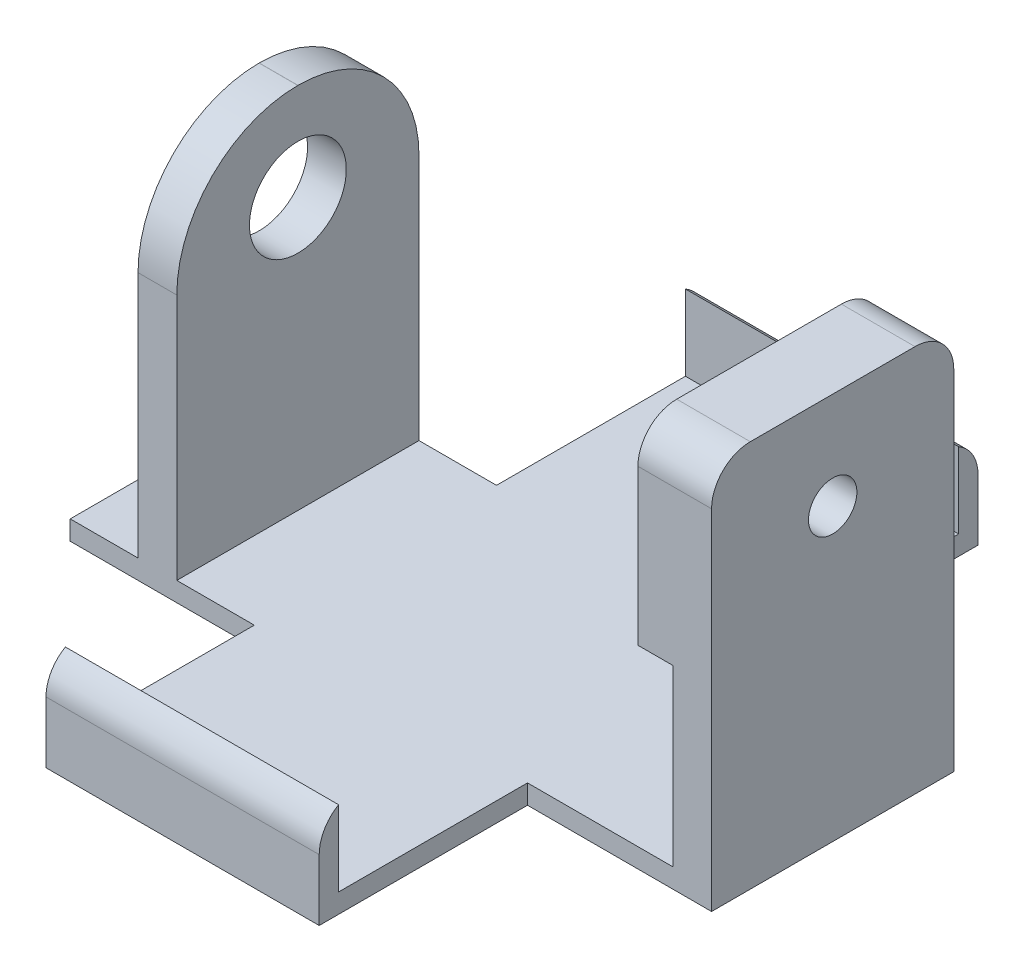
ISO-10303-21;
HEADER;
FILE_DESCRIPTION(('STEP AP214'),'2;1');
FILE_NAME('part.step','',(''),(''),'','','');
FILE_SCHEMA(('AUTOMOTIVE_DESIGN { 1 0 10303 214 1 1 1 1 }'));
ENDSEC;
DATA;
#1=APPLICATION_CONTEXT('core data for automotive mechanical design processes');
#2=APPLICATION_PROTOCOL_DEFINITION('international standard','automotive_design',2000,#1);
#3=PRODUCT_CONTEXT('',#1,'mechanical');
#4=PRODUCT('Part','Part','',(#3));
#5=PRODUCT_RELATED_PRODUCT_CATEGORY('part','',(#4));
#6=PRODUCT_DEFINITION_FORMATION('','',#4);
#7=PRODUCT_DEFINITION_CONTEXT('part definition',#1,'design');
#8=PRODUCT_DEFINITION('design','',#6,#7);
#9=PRODUCT_DEFINITION_SHAPE('','',#8);
#10=(LENGTH_UNIT() NAMED_UNIT(*) SI_UNIT(.MILLI.,.METRE.));
#11=(NAMED_UNIT(*) PLANE_ANGLE_UNIT() SI_UNIT($,.RADIAN.));
#12=(NAMED_UNIT(*) SI_UNIT($,.STERADIAN.) SOLID_ANGLE_UNIT());
#13=UNCERTAINTY_MEASURE_WITH_UNIT(LENGTH_MEASURE(1.E-05),#10,'distance_accuracy_value','');
#14=(GEOMETRIC_REPRESENTATION_CONTEXT(3) GLOBAL_UNCERTAINTY_ASSIGNED_CONTEXT((#13)) GLOBAL_UNIT_ASSIGNED_CONTEXT((#10,
#11,#12)) REPRESENTATION_CONTEXT('',''));
#15=CARTESIAN_POINT('',(0.,0.,0.));
#16=DIRECTION('',(0.,0.,1.));
#17=DIRECTION('',(1.,0.,0.));
#18=AXIS2_PLACEMENT_3D('',#15,#16,#17);
#19=CARTESIAN_POINT('',(0.,2.,0.));
#20=DIRECTION('',(0.,-1.,0.));
#21=DIRECTION('',(0.,0.,-1.));
#22=AXIS2_PLACEMENT_3D('',#19,#20,#21);
#23=PLANE('',#22);
#24=DIRECTION('',(0.,0.,-1.));
#25=VECTOR('',#24,1.);
#26=CARTESIAN_POINT('',(-22.1,2.,0.));
#27=LINE('',#26,#25);
#28=CARTESIAN_POINT('',(-22.1,2.,12.5));
#29=VERTEX_POINT('',#28);
#30=CARTESIAN_POINT('',(-22.1,2.,-12.5));
#31=VERTEX_POINT('',#30);
#32=EDGE_CURVE('E293',#29,#31,#27,.T.);
#33=ORIENTED_EDGE('',*,*,#32,.F.);
#34=DIRECTION('',(1.,0.,0.));
#35=VECTOR('',#34,1.);
#36=CARTESIAN_POINT('',(-33.1,2.,12.5));
#37=LINE('',#36,#35);
#38=CARTESIAN_POINT('',(-14.1,2.,12.5));
#39=VERTEX_POINT('',#38);
#40=EDGE_CURVE('E233',#29,#39,#37,.T.);
#41=ORIENTED_EDGE('',*,*,#40,.T.);
#42=DIRECTION('',(0.,0.,1.));
#43=VECTOR('',#42,1.);
#44=CARTESIAN_POINT('',(-14.1,2.,34.));
#45=LINE('',#44,#43);
#46=CARTESIAN_POINT('',(-14.1,2.,32.));
#47=VERTEX_POINT('',#46);
#48=EDGE_CURVE('E395',#39,#47,#45,.T.);
#49=ORIENTED_EDGE('',*,*,#48,.T.);
#50=DIRECTION('',(-1.,0.,0.));
#51=VECTOR('',#50,1.);
#52=CARTESIAN_POINT('',(0.,2.,32.));
#53=LINE('',#52,#51);
#54=CARTESIAN_POINT('',(14.1,2.,32.));
#55=VERTEX_POINT('',#54);
#56=EDGE_CURVE('E371',#55,#47,#53,.T.);
#57=ORIENTED_EDGE('',*,*,#56,.F.);
#58=DIRECTION('',(0.,0.,-1.));
#59=VECTOR('',#58,1.);
#60=CARTESIAN_POINT('',(14.1,2.,34.));
#61=LINE('',#60,#59);
#62=CARTESIAN_POINT('',(14.1,2.,12.5));
#63=VERTEX_POINT('',#62);
#64=EDGE_CURVE('E398',#55,#63,#61,.T.);
#65=ORIENTED_EDGE('',*,*,#64,.T.);
#66=DIRECTION('',(1.,0.,0.));
#67=VECTOR('',#66,1.);
#68=CARTESIAN_POINT('',(14.1,2.,12.5));
#69=LINE('',#68,#67);
#70=CARTESIAN_POINT('',(29.1,2.,12.5));
#71=VERTEX_POINT('',#70);
#72=EDGE_CURVE('E401',#63,#71,#69,.T.);
#73=ORIENTED_EDGE('',*,*,#72,.T.);
#74=DIRECTION('',(0.,0.,1.));
#75=VECTOR('',#74,1.);
#76=CARTESIAN_POINT('',(29.1,2.,-34.001));
#77=LINE('',#76,#75);
#78=CARTESIAN_POINT('',(29.1,2.,-12.5));
#79=VERTEX_POINT('',#78);
#80=EDGE_CURVE('E311',#79,#71,#77,.T.);
#81=ORIENTED_EDGE('',*,*,#80,.F.);
#82=DIRECTION('',(-1.,0.,0.));
#83=VECTOR('',#82,1.);
#84=CARTESIAN_POINT('',(14.1,2.,-12.5));
#85=LINE('',#84,#83);
#86=CARTESIAN_POINT('',(14.1,2.,-12.5));
#87=VERTEX_POINT('',#86);
#88=EDGE_CURVE('E404',#79,#87,#85,.T.);
#89=ORIENTED_EDGE('',*,*,#88,.T.);
#90=DIRECTION('',(0.,0.,-1.));
#91=VECTOR('',#90,1.);
#92=CARTESIAN_POINT('',(14.1,2.,-12.5));
#93=LINE('',#92,#91);
#94=CARTESIAN_POINT('',(14.1,2.,-32.));
#95=VERTEX_POINT('',#94);
#96=EDGE_CURVE('E376',#87,#95,#93,.T.);
#97=ORIENTED_EDGE('',*,*,#96,.T.);
#98=DIRECTION('',(1.,0.,0.));
#99=VECTOR('',#98,1.);
#100=CARTESIAN_POINT('',(0.,2.,-32.));
#101=LINE('',#100,#99);
#102=CARTESIAN_POINT('',(-14.1,2.,-32.));
#103=VERTEX_POINT('',#102);
#104=EDGE_CURVE('E356',#103,#95,#101,.T.);
#105=ORIENTED_EDGE('',*,*,#104,.F.);
#106=DIRECTION('',(0.,0.,1.));
#107=VECTOR('',#106,1.);
#108=CARTESIAN_POINT('',(-14.1,2.,-12.5));
#109=LINE('',#108,#107);
#110=CARTESIAN_POINT('',(-14.1,2.,-12.5));
#111=VERTEX_POINT('',#110);
#112=EDGE_CURVE('E379',#103,#111,#109,.T.);
#113=ORIENTED_EDGE('',*,*,#112,.T.);
#114=DIRECTION('',(-1.,0.,0.));
#115=VECTOR('',#114,1.);
#116=CARTESIAN_POINT('',(-33.1,2.,-12.5));
#117=LINE('',#116,#115);
#118=EDGE_CURVE('E384',#111,#31,#117,.T.);
#119=ORIENTED_EDGE('',*,*,#118,.T.);
#120=EDGE_LOOP('',(#33,#41,#49,#57,#65,#73,#81,#89,#97,#105,#113,#119));
#121=FACE_BOUND('',#120,.T.);
#122=ADVANCED_FACE('F39',(#121),#23,.F.);
#123=CARTESIAN_POINT('',(-33.1,2.,12.5));
#124=VERTEX_POINT('',#123);
#125=CARTESIAN_POINT('',(-26.1,2.,12.5));
#126=VERTEX_POINT('',#125);
#127=EDGE_CURVE('E391',#124,#126,#37,.T.);
#128=ORIENTED_EDGE('',*,*,#127,.T.);
#129=DIRECTION('',(0.,0.,-1.));
#130=VECTOR('',#129,1.);
#131=CARTESIAN_POINT('',(-26.1,2.,0.));
#132=LINE('',#131,#130);
#133=CARTESIAN_POINT('',(-26.1,2.,-12.5));
#134=VERTEX_POINT('',#133);
#135=EDGE_CURVE('E285',#126,#134,#132,.T.);
#136=ORIENTED_EDGE('',*,*,#135,.T.);
#137=CARTESIAN_POINT('',(-33.1,2.,-12.5));
#138=VERTEX_POINT('',#137);
#139=EDGE_CURVE('E383',#134,#138,#117,.T.);
#140=ORIENTED_EDGE('',*,*,#139,.T.);
#141=DIRECTION('',(0.,0.,1.));
#142=VECTOR('',#141,1.);
#143=CARTESIAN_POINT('',(-33.1,2.,-12.5));
#144=LINE('',#143,#142);
#145=EDGE_CURVE('E388',#138,#124,#144,.T.);
#146=ORIENTED_EDGE('',*,*,#145,.T.);
#147=EDGE_LOOP('',(#128,#136,#140,#146));
#148=FACE_BOUND('',#147,.T.);
#149=ADVANCED_FACE('F587',(#148),#23,.F.);
#150=CARTESIAN_POINT('',(14.1,2.,-12.5));
#151=DIRECTION('',(-1.,0.,0.));
#152=DIRECTION('',(0.,0.,1.));
#153=AXIS2_PLACEMENT_3D('',#150,#151,#152);
#154=PLANE('',#153);
#155=DIRECTION('',(0.,-1.,0.));
#156=VECTOR('',#155,1.);
#157=CARTESIAN_POINT('',(14.1,2.,-34.));
#158=LINE('',#157,#156);
#159=CARTESIAN_POINT('',(14.1,6.33589838486222,-34.));
#160=VERTEX_POINT('',#159);
#161=CARTESIAN_POINT('',(14.1,0.,-34.));
#162=VERTEX_POINT('',#161);
#163=EDGE_CURVE('E486',#160,#162,#158,.T.);
#164=ORIENTED_EDGE('',*,*,#163,.F.);
#165=CARTESIAN_POINT('',(14.1,6.33589838486222,-30.));
#166=DIRECTION('',(-1.,0.,0.));
#167=DIRECTION('',(0.,0.,1.));
#168=AXIS2_PLACEMENT_3D('',#165,#166,#167);
#169=CIRCLE('',#168,4.);
#170=CARTESIAN_POINT('',(14.1,9.8,-32.));
#171=VERTEX_POINT('',#170);
#172=EDGE_CURVE('E505',#160,#171,#169,.F.);
#173=ORIENTED_EDGE('',*,*,#172,.T.);
#174=DIRECTION('',(0.,1.,0.));
#175=VECTOR('',#174,1.);
#176=CARTESIAN_POINT('',(14.1,9.8,-32.));
#177=LINE('',#176,#175);
#178=EDGE_CURVE('E352',#95,#171,#177,.T.);
#179=ORIENTED_EDGE('',*,*,#178,.F.);
#180=ORIENTED_EDGE('',*,*,#96,.F.);
#181=DIRECTION('',(0.,-1.,0.));
#182=VECTOR('',#181,1.);
#183=CARTESIAN_POINT('',(14.1,2.,-12.5));
#184=LINE('',#183,#182);
#185=CARTESIAN_POINT('',(14.1,0.,-12.5));
#186=VERTEX_POINT('',#185);
#187=EDGE_CURVE('E407',#87,#186,#184,.T.);
#188=ORIENTED_EDGE('',*,*,#187,.T.);
#189=DIRECTION('',(0.,0.,-1.));
#190=VECTOR('',#189,1.);
#191=CARTESIAN_POINT('',(14.1,0.,-12.5));
#192=LINE('',#191,#190);
#193=EDGE_CURVE('E375',#186,#162,#192,.T.);
#194=ORIENTED_EDGE('',*,*,#193,.T.);
#195=EDGE_LOOP('',(#164,#173,#179,#180,#188,#194));
#196=FACE_BOUND('',#195,.T.);
#197=ADVANCED_FACE('F559',(#196),#154,.F.);
#198=CARTESIAN_POINT('',(-14.1,2.,-34.));
#199=DIRECTION('',(0.,0.,1.));
#200=DIRECTION('',(1.,0.,0.));
#201=AXIS2_PLACEMENT_3D('',#198,#199,#200);
#202=PLANE('',#201);
#203=DIRECTION('',(0.,-1.,0.));
#204=VECTOR('',#203,1.);
#205=CARTESIAN_POINT('',(-14.1,2.,-34.));
#206=LINE('',#205,#204);
#207=CARTESIAN_POINT('',(-14.1,6.33589838486222,-34.));
#208=VERTEX_POINT('',#207);
#209=CARTESIAN_POINT('',(-14.1,0.,-34.));
#210=VERTEX_POINT('',#209);
#211=EDGE_CURVE('E483',#208,#210,#206,.T.);
#212=ORIENTED_EDGE('',*,*,#211,.F.);
#213=DIRECTION('',(1.,0.,0.));
#214=VECTOR('',#213,1.);
#215=CARTESIAN_POINT('',(-14.1,6.33589838486222,-34.));
#216=LINE('',#215,#214);
#217=EDGE_CURVE('E502',#208,#160,#216,.T.);
#218=ORIENTED_EDGE('',*,*,#217,.T.);
#219=ORIENTED_EDGE('',*,*,#163,.T.);
#220=DIRECTION('',(-1.,0.,0.));
#221=VECTOR('',#220,1.);
#222=CARTESIAN_POINT('',(-14.1,0.,-34.));
#223=LINE('',#222,#221);
#224=EDGE_CURVE('E411',#162,#210,#223,.T.);
#225=ORIENTED_EDGE('',*,*,#224,.T.);
#226=EDGE_LOOP('',(#212,#218,#219,#225));
#227=FACE_BOUND('',#226,.T.);
#228=ADVANCED_FACE('F669',(#227),#202,.F.);
#229=CARTESIAN_POINT('',(-14.1,2.,-12.5));
#230=DIRECTION('',(1.,0.,0.));
#231=DIRECTION('',(0.,0.,-1.));
#232=AXIS2_PLACEMENT_3D('',#229,#230,#231);
#233=PLANE('',#232);
#234=DIRECTION('',(0.,-1.,0.));
#235=VECTOR('',#234,1.);
#236=CARTESIAN_POINT('',(-14.1,9.8,-32.));
#237=LINE('',#236,#235);
#238=CARTESIAN_POINT('',(-14.1,9.8,-32.));
#239=VERTEX_POINT('',#238);
#240=EDGE_CURVE('E341',#239,#103,#237,.T.);
#241=ORIENTED_EDGE('',*,*,#240,.F.);
#242=CARTESIAN_POINT('',(-14.1,6.33589838486222,-30.));
#243=DIRECTION('',(1.,0.,0.));
#244=DIRECTION('',(0.,0.,-1.));
#245=AXIS2_PLACEMENT_3D('',#242,#243,#244);
#246=CIRCLE('',#245,4.);
#247=EDGE_CURVE('E499',#239,#208,#246,.F.);
#248=ORIENTED_EDGE('',*,*,#247,.T.);
#249=ORIENTED_EDGE('',*,*,#211,.T.);
#250=DIRECTION('',(0.,0.,1.));
#251=VECTOR('',#250,1.);
#252=CARTESIAN_POINT('',(-14.1,0.,-12.5));
#253=LINE('',#252,#251);
#254=CARTESIAN_POINT('',(-14.1,0.,-12.5));
#255=VERTEX_POINT('',#254);
#256=EDGE_CURVE('E415',#210,#255,#253,.T.);
#257=ORIENTED_EDGE('',*,*,#256,.T.);
#258=DIRECTION('',(0.,-1.,0.));
#259=VECTOR('',#258,1.);
#260=CARTESIAN_POINT('',(-14.1,2.,-12.5));
#261=LINE('',#260,#259);
#262=EDGE_CURVE('E479',#111,#255,#261,.T.);
#263=ORIENTED_EDGE('',*,*,#262,.F.);
#264=ORIENTED_EDGE('',*,*,#112,.F.);
#265=EDGE_LOOP('',(#241,#248,#249,#257,#263,#264));
#266=FACE_BOUND('',#265,.T.);
#267=ADVANCED_FACE('F569',(#266),#233,.F.);
#268=CARTESIAN_POINT('',(-33.1,2.,-12.5));
#269=DIRECTION('',(0.,0.,1.));
#270=DIRECTION('',(1.,0.,0.));
#271=AXIS2_PLACEMENT_3D('',#268,#269,#270);
#272=PLANE('',#271);
#273=ORIENTED_EDGE('',*,*,#139,.F.);
#274=DIRECTION('',(0.,-1.,0.));
#275=VECTOR('',#274,1.);
#276=CARTESIAN_POINT('',(-26.1,0.,-12.5));
#277=LINE('',#276,#275);
#278=CARTESIAN_POINT('',(-26.1,27.5099999999999,-12.5));
#279=VERTEX_POINT('',#278);
#280=EDGE_CURVE('E55',#279,#134,#277,.T.);
#281=ORIENTED_EDGE('',*,*,#280,.F.);
#282=DIRECTION('',(-1.,0.,0.));
#283=VECTOR('',#282,1.);
#284=CARTESIAN_POINT('',(-22.1,27.5099999999999,-12.5));
#285=LINE('',#284,#283);
#286=CARTESIAN_POINT('',(-22.1,27.5099999999999,-12.5));
#287=VERTEX_POINT('',#286);
#288=EDGE_CURVE('E282',#287,#279,#285,.T.);
#289=ORIENTED_EDGE('',*,*,#288,.F.);
#290=DIRECTION('',(0.,-1.,0.));
#291=VECTOR('',#290,1.);
#292=CARTESIAN_POINT('',(-22.1,0.,-12.5));
#293=LINE('',#292,#291);
#294=EDGE_CURVE('E247',#287,#31,#293,.T.);
#295=ORIENTED_EDGE('',*,*,#294,.T.);
#296=ORIENTED_EDGE('',*,*,#118,.F.);
#297=ORIENTED_EDGE('',*,*,#262,.T.);
#298=DIRECTION('',(-1.,0.,0.));
#299=VECTOR('',#298,1.);
#300=CARTESIAN_POINT('',(-33.1,0.,-12.5));
#301=LINE('',#300,#299);
#302=CARTESIAN_POINT('',(-33.1,0.,-12.5));
#303=VERTEX_POINT('',#302);
#304=EDGE_CURVE('E418',#255,#303,#301,.T.);
#305=ORIENTED_EDGE('',*,*,#304,.T.);
#306=DIRECTION('',(0.,-1.,0.));
#307=VECTOR('',#306,1.);
#308=CARTESIAN_POINT('',(-33.1,2.,-12.5));
#309=LINE('',#308,#307);
#310=EDGE_CURVE('E475',#138,#303,#309,.T.);
#311=ORIENTED_EDGE('',*,*,#310,.F.);
#312=EDGE_LOOP('',(#273,#281,#289,#295,#296,#297,#305,#311));
#313=FACE_BOUND('',#312,.T.);
#314=ADVANCED_FACE('F575',(#313),#272,.F.);
#315=CARTESIAN_POINT('',(-33.1,2.,-12.5));
#316=DIRECTION('',(1.,0.,0.));
#317=DIRECTION('',(0.,0.,-1.));
#318=AXIS2_PLACEMENT_3D('',#315,#316,#317);
#319=PLANE('',#318);
#320=DIRECTION('',(0.,0.,1.));
#321=VECTOR('',#320,1.);
#322=CARTESIAN_POINT('',(-33.1,0.,-12.5));
#323=LINE('',#322,#321);
#324=CARTESIAN_POINT('',(-33.1,0.,12.5));
#325=VERTEX_POINT('',#324);
#326=EDGE_CURVE('E421',#303,#325,#323,.T.);
#327=ORIENTED_EDGE('',*,*,#326,.T.);
#328=DIRECTION('',(0.,-1.,0.));
#329=VECTOR('',#328,1.);
#330=CARTESIAN_POINT('',(-33.1,2.,12.5));
#331=LINE('',#330,#329);
#332=EDGE_CURVE('E471',#124,#325,#331,.T.);
#333=ORIENTED_EDGE('',*,*,#332,.F.);
#334=ORIENTED_EDGE('',*,*,#145,.F.);
#335=ORIENTED_EDGE('',*,*,#310,.T.);
#336=EDGE_LOOP('',(#327,#333,#334,#335));
#337=FACE_BOUND('',#336,.T.);
#338=ADVANCED_FACE('F592',(#337),#319,.F.);
#339=CARTESIAN_POINT('',(-33.1,2.,12.5));
#340=DIRECTION('',(0.,0.,-1.));
#341=DIRECTION('',(-1.,0.,0.));
#342=AXIS2_PLACEMENT_3D('',#339,#340,#341);
#343=PLANE('',#342);
#344=DIRECTION('',(1.,0.,0.));
#345=VECTOR('',#344,1.);
#346=CARTESIAN_POINT('',(-33.1,0.,12.5));
#347=LINE('',#346,#345);
#348=CARTESIAN_POINT('',(-14.1,0.,12.5));
#349=VERTEX_POINT('',#348);
#350=EDGE_CURVE('E424',#325,#349,#347,.T.);
#351=ORIENTED_EDGE('',*,*,#350,.T.);
#352=DIRECTION('',(0.,-1.,0.));
#353=VECTOR('',#352,1.);
#354=CARTESIAN_POINT('',(-14.1,2.,12.5));
#355=LINE('',#354,#353);
#356=EDGE_CURVE('E467',#39,#349,#355,.T.);
#357=ORIENTED_EDGE('',*,*,#356,.F.);
#358=ORIENTED_EDGE('',*,*,#40,.F.);
#359=DIRECTION('',(0.,1.,0.));
#360=VECTOR('',#359,1.);
#361=CARTESIAN_POINT('',(-22.1,0.,12.5));
#362=LINE('',#361,#360);
#363=CARTESIAN_POINT('',(-22.1,27.5099999999999,12.5));
#364=VERTEX_POINT('',#363);
#365=EDGE_CURVE('E226',#29,#364,#362,.T.);
#366=ORIENTED_EDGE('',*,*,#365,.T.);
#367=DIRECTION('',(-1.,0.,0.));
#368=VECTOR('',#367,1.);
#369=CARTESIAN_POINT('',(-22.1,27.5099999999999,12.5));
#370=LINE('',#369,#368);
#371=CARTESIAN_POINT('',(-26.1,27.5099999999999,12.5));
#372=VERTEX_POINT('',#371);
#373=EDGE_CURVE('E230',#364,#372,#370,.T.);
#374=ORIENTED_EDGE('',*,*,#373,.T.);
#375=DIRECTION('',(0.,1.,0.));
#376=VECTOR('',#375,1.);
#377=CARTESIAN_POINT('',(-26.1,0.,12.5));
#378=LINE('',#377,#376);
#379=EDGE_CURVE('E267',#126,#372,#378,.T.);
#380=ORIENTED_EDGE('',*,*,#379,.F.);
#381=ORIENTED_EDGE('',*,*,#127,.F.);
#382=ORIENTED_EDGE('',*,*,#332,.T.);
#383=EDGE_LOOP('',(#351,#357,#358,#366,#374,#380,#381,#382));
#384=FACE_BOUND('',#383,.T.);
#385=ADVANCED_FACE('F228',(#384),#343,.F.);
#386=CARTESIAN_POINT('',(-14.1,2.,34.));
#387=DIRECTION('',(1.,0.,0.));
#388=DIRECTION('',(0.,0.,-1.));
#389=AXIS2_PLACEMENT_3D('',#386,#387,#388);
#390=PLANE('',#389);
#391=DIRECTION('',(0.,0.,1.));
#392=VECTOR('',#391,1.);
#393=CARTESIAN_POINT('',(-14.1,0.,34.));
#394=LINE('',#393,#392);
#395=CARTESIAN_POINT('',(-14.1,0.,34.));
#396=VERTEX_POINT('',#395);
#397=EDGE_CURVE('E427',#349,#396,#394,.T.);
#398=ORIENTED_EDGE('',*,*,#397,.T.);
#399=DIRECTION('',(0.,-1.,0.));
#400=VECTOR('',#399,1.);
#401=CARTESIAN_POINT('',(-14.1,2.,34.));
#402=LINE('',#401,#400);
#403=CARTESIAN_POINT('',(-14.1,6.33589838486225,34.));
#404=VERTEX_POINT('',#403);
#405=EDGE_CURVE('E464',#404,#396,#402,.T.);
#406=ORIENTED_EDGE('',*,*,#405,.F.);
#407=CARTESIAN_POINT('',(-14.1,6.33589838486225,30.));
#408=DIRECTION('',(1.,0.,0.));
#409=DIRECTION('',(0.,0.,-1.));
#410=AXIS2_PLACEMENT_3D('',#407,#408,#409);
#411=CIRCLE('',#410,4.);
#412=CARTESIAN_POINT('',(-14.1,9.8,32.));
#413=VERTEX_POINT('',#412);
#414=EDGE_CURVE('E493',#404,#413,#411,.F.);
#415=ORIENTED_EDGE('',*,*,#414,.T.);
#416=DIRECTION('',(0.,-1.,0.));
#417=VECTOR('',#416,1.);
#418=CARTESIAN_POINT('',(-14.1,9.8,32.));
#419=LINE('',#418,#417);
#420=EDGE_CURVE('E360',#413,#47,#419,.T.);
#421=ORIENTED_EDGE('',*,*,#420,.T.);
#422=ORIENTED_EDGE('',*,*,#48,.F.);
#423=ORIENTED_EDGE('',*,*,#356,.T.);
#424=EDGE_LOOP('',(#398,#406,#415,#421,#422,#423));
#425=FACE_BOUND('',#424,.T.);
#426=ADVANCED_FACE('F599',(#425),#390,.F.);
#427=CARTESIAN_POINT('',(-14.1,2.,34.));
#428=DIRECTION('',(0.,0.,-1.));
#429=DIRECTION('',(-1.,0.,0.));
#430=AXIS2_PLACEMENT_3D('',#427,#428,#429);
#431=PLANE('',#430);
#432=DIRECTION('',(1.,0.,0.));
#433=VECTOR('',#432,1.);
#434=CARTESIAN_POINT('',(-14.1,0.,34.));
#435=LINE('',#434,#433);
#436=CARTESIAN_POINT('',(14.1,0.,34.));
#437=VERTEX_POINT('',#436);
#438=EDGE_CURVE('E431',#396,#437,#435,.T.);
#439=ORIENTED_EDGE('',*,*,#438,.T.);
#440=DIRECTION('',(0.,-1.,0.));
#441=VECTOR('',#440,1.);
#442=CARTESIAN_POINT('',(14.1,2.,34.));
#443=LINE('',#442,#441);
#444=CARTESIAN_POINT('',(14.1,6.33589838486225,34.));
#445=VERTEX_POINT('',#444);
#446=EDGE_CURVE('E461',#445,#437,#443,.T.);
#447=ORIENTED_EDGE('',*,*,#446,.F.);
#448=DIRECTION('',(1.,0.,0.));
#449=VECTOR('',#448,1.);
#450=CARTESIAN_POINT('',(-14.1,6.33589838486225,34.));
#451=LINE('',#450,#449);
#452=EDGE_CURVE('E489',#445,#404,#451,.F.);
#453=ORIENTED_EDGE('',*,*,#452,.T.);
#454=ORIENTED_EDGE('',*,*,#405,.T.);
#455=EDGE_LOOP('',(#439,#447,#453,#454));
#456=FACE_BOUND('',#455,.T.);
#457=ADVANCED_FACE('F627',(#456),#431,.F.);
#458=CARTESIAN_POINT('',(14.1,2.,34.));
#459=DIRECTION('',(-1.,0.,0.));
#460=DIRECTION('',(0.,0.,1.));
#461=AXIS2_PLACEMENT_3D('',#458,#459,#460);
#462=PLANE('',#461);
#463=ORIENTED_EDGE('',*,*,#64,.F.);
#464=DIRECTION('',(0.,1.,0.));
#465=VECTOR('',#464,1.);
#466=CARTESIAN_POINT('',(14.1,9.8,32.));
#467=LINE('',#466,#465);
#468=CARTESIAN_POINT('',(14.1,9.8,32.));
#469=VERTEX_POINT('',#468);
#470=EDGE_CURVE('E364',#55,#469,#467,.T.);
#471=ORIENTED_EDGE('',*,*,#470,.T.);
#472=CARTESIAN_POINT('',(14.1,6.33589838486225,30.));
#473=DIRECTION('',(-1.,0.,0.));
#474=DIRECTION('',(0.,0.,1.));
#475=AXIS2_PLACEMENT_3D('',#472,#473,#474);
#476=CIRCLE('',#475,4.);
#477=EDGE_CURVE('E496',#469,#445,#476,.F.);
#478=ORIENTED_EDGE('',*,*,#477,.T.);
#479=ORIENTED_EDGE('',*,*,#446,.T.);
#480=DIRECTION('',(0.,0.,-1.));
#481=VECTOR('',#480,1.);
#482=CARTESIAN_POINT('',(14.1,0.,34.));
#483=LINE('',#482,#481);
#484=CARTESIAN_POINT('',(14.1,0.,12.5));
#485=VERTEX_POINT('',#484);
#486=EDGE_CURVE('E435',#437,#485,#483,.T.);
#487=ORIENTED_EDGE('',*,*,#486,.T.);
#488=DIRECTION('',(0.,-1.,0.));
#489=VECTOR('',#488,1.);
#490=CARTESIAN_POINT('',(14.1,2.,12.5));
#491=LINE('',#490,#489);
#492=EDGE_CURVE('E457',#63,#485,#491,.T.);
#493=ORIENTED_EDGE('',*,*,#492,.F.);
#494=EDGE_LOOP('',(#463,#471,#478,#479,#487,#493));
#495=FACE_BOUND('',#494,.T.);
#496=ADVANCED_FACE('F609',(#495),#462,.F.);
#497=CARTESIAN_POINT('',(14.1,2.,12.5));
#498=DIRECTION('',(0.,0.,-1.));
#499=DIRECTION('',(-1.,0.,0.));
#500=AXIS2_PLACEMENT_3D('',#497,#498,#499);
#501=PLANE('',#500);
#502=DIRECTION('',(0.,-1.,0.));
#503=VECTOR('',#502,1.);
#504=CARTESIAN_POINT('',(25.5,0.,12.5));
#505=LINE('',#504,#503);
#506=CARTESIAN_POINT('',(25.5,36.,12.5));
#507=VERTEX_POINT('',#506);
#508=CARTESIAN_POINT('',(25.5,20.,12.5));
#509=VERTEX_POINT('',#508);
#510=EDGE_CURVE('E338',#507,#509,#505,.T.);
#511=ORIENTED_EDGE('',*,*,#510,.T.);
#512=DIRECTION('',(-1.,0.,0.));
#513=VECTOR('',#512,1.);
#514=CARTESIAN_POINT('',(25.5,20.,12.5));
#515=LINE('',#514,#513);
#516=CARTESIAN_POINT('',(29.1,20.,12.5));
#517=VERTEX_POINT('',#516);
#518=EDGE_CURVE('E308',#517,#509,#515,.T.);
#519=ORIENTED_EDGE('',*,*,#518,.F.);
#520=DIRECTION('',(0.,1.,0.));
#521=VECTOR('',#520,1.);
#522=CARTESIAN_POINT('',(29.1,2.,12.5));
#523=LINE('',#522,#521);
#524=EDGE_CURVE('E304',#71,#517,#523,.T.);
#525=ORIENTED_EDGE('',*,*,#524,.F.);
#526=ORIENTED_EDGE('',*,*,#72,.F.);
#527=ORIENTED_EDGE('',*,*,#492,.T.);
#528=DIRECTION('',(1.,0.,0.));
#529=VECTOR('',#528,1.);
#530=CARTESIAN_POINT('',(14.1,0.,12.5));
#531=LINE('',#530,#529);
#532=CARTESIAN_POINT('',(33.1,0.,12.5));
#533=VERTEX_POINT('',#532);
#534=EDGE_CURVE('E438',#485,#533,#531,.T.);
#535=ORIENTED_EDGE('',*,*,#534,.T.);
#536=DIRECTION('',(0.,-1.,0.));
#537=VECTOR('',#536,1.);
#538=CARTESIAN_POINT('',(33.1,2.,12.5));
#539=LINE('',#538,#537);
#540=CARTESIAN_POINT('',(33.1,36.,12.5));
#541=VERTEX_POINT('',#540);
#542=EDGE_CURVE('E454',#541,#533,#539,.T.);
#543=ORIENTED_EDGE('',*,*,#542,.F.);
#544=DIRECTION('',(1.,0.,0.));
#545=VECTOR('',#544,1.);
#546=CARTESIAN_POINT('',(25.5,36.,12.5));
#547=LINE('',#546,#545);
#548=EDGE_CURVE('E11',#541,#507,#547,.F.);
#549=ORIENTED_EDGE('',*,*,#548,.T.);
#550=EDGE_LOOP('',(#511,#519,#525,#526,#527,#535,#543,#549));
#551=FACE_BOUND('',#550,.T.);
#552=ADVANCED_FACE('F617',(#551),#501,.F.);
#553=CARTESIAN_POINT('',(33.1,2.,-12.5));
#554=DIRECTION('',(-1.,0.,0.));
#555=DIRECTION('',(0.,0.,1.));
#556=AXIS2_PLACEMENT_3D('',#553,#554,#555);
#557=PLANE('',#556);
#558=DIRECTION('',(0.,-1.,0.));
#559=VECTOR('',#558,1.);
#560=CARTESIAN_POINT('',(33.1,2.,-12.5));
#561=LINE('',#560,#559);
#562=CARTESIAN_POINT('',(33.1,36.,-12.5));
#563=VERTEX_POINT('',#562);
#564=CARTESIAN_POINT('',(33.1,0.,-12.5));
#565=VERTEX_POINT('',#564);
#566=EDGE_CURVE('E451',#563,#565,#561,.T.);
#567=ORIENTED_EDGE('',*,*,#566,.F.);
#568=CARTESIAN_POINT('',(33.1,36.,-8.50000000000002));
#569=DIRECTION('',(-1.,0.,0.));
#570=DIRECTION('',(0.,0.,1.));
#571=AXIS2_PLACEMENT_3D('',#568,#569,#570);
#572=CIRCLE('',#571,4.);
#573=CARTESIAN_POINT('',(33.1,40.,-8.50000000000002));
#574=VERTEX_POINT('',#573);
#575=EDGE_CURVE('E515',#563,#574,#572,.F.);
#576=ORIENTED_EDGE('',*,*,#575,.T.);
#577=DIRECTION('',(0.,0.,1.));
#578=VECTOR('',#577,1.);
#579=CARTESIAN_POINT('',(33.1,40.,-12.5));
#580=LINE('',#579,#578);
#581=CARTESIAN_POINT('',(33.1,40.,8.49999999999998));
#582=VERTEX_POINT('',#581);
#583=EDGE_CURVE('E327',#574,#582,#580,.T.);
#584=ORIENTED_EDGE('',*,*,#583,.T.);
#585=CARTESIAN_POINT('',(33.1,36.,8.49999999999998));
#586=DIRECTION('',(-1.,0.,0.));
#587=DIRECTION('',(0.,0.,1.));
#588=AXIS2_PLACEMENT_3D('',#585,#586,#587);
#589=CIRCLE('',#588,4.);
#590=EDGE_CURVE('E512',#582,#541,#589,.F.);
#591=ORIENTED_EDGE('',*,*,#590,.T.);
#592=ORIENTED_EDGE('',*,*,#542,.T.);
#593=DIRECTION('',(0.,0.,-1.));
#594=VECTOR('',#593,1.);
#595=CARTESIAN_POINT('',(33.1,0.,-12.5));
#596=LINE('',#595,#594);
#597=EDGE_CURVE('E442',#533,#565,#596,.T.);
#598=ORIENTED_EDGE('',*,*,#597,.T.);
#599=EDGE_LOOP('',(#567,#576,#584,#591,#592,#598));
#600=FACE_BOUND('',#599,.T.);
#601=CARTESIAN_POINT('',(33.1,30.,0.));
#602=DIRECTION('',(1.,0.,0.));
#603=DIRECTION('',(0.,0.,-1.));
#604=AXIS2_PLACEMENT_3D('',#601,#602,#603);
#605=CIRCLE('',#604,2.5);
#606=CARTESIAN_POINT('',(33.1,30.,-2.50000000000002));
#607=VERTEX_POINT('',#606);
#608=EDGE_CURVE('E316',#607,#607,#605,.T.);
#609=ORIENTED_EDGE('',*,*,#608,.F.);
#610=EDGE_LOOP('',(#609));
#611=FACE_BOUND('',#610,.T.);
#612=ADVANCED_FACE('F544',(#600,#611),#557,.F.);
#613=CARTESIAN_POINT('',(14.1,2.,-12.5));
#614=DIRECTION('',(0.,0.,1.));
#615=DIRECTION('',(1.,0.,0.));
#616=AXIS2_PLACEMENT_3D('',#613,#614,#615);
#617=PLANE('',#616);
#618=DIRECTION('',(0.,-1.,0.));
#619=VECTOR('',#618,1.);
#620=CARTESIAN_POINT('',(29.1,2.,-12.5));
#621=LINE('',#620,#619);
#622=CARTESIAN_POINT('',(29.1,20.,-12.5));
#623=VERTEX_POINT('',#622);
#624=EDGE_CURVE('E296',#623,#79,#621,.T.);
#625=ORIENTED_EDGE('',*,*,#624,.F.);
#626=DIRECTION('',(1.,0.,0.));
#627=VECTOR('',#626,1.);
#628=CARTESIAN_POINT('',(25.5,20.,-12.5));
#629=LINE('',#628,#627);
#630=CARTESIAN_POINT('',(25.5,20.,-12.5));
#631=VERTEX_POINT('',#630);
#632=EDGE_CURVE('E300',#631,#623,#629,.T.);
#633=ORIENTED_EDGE('',*,*,#632,.F.);
#634=DIRECTION('',(0.,1.,0.));
#635=VECTOR('',#634,1.);
#636=CARTESIAN_POINT('',(25.5,0.,-12.5));
#637=LINE('',#636,#635);
#638=CARTESIAN_POINT('',(25.5,36.,-12.5));
#639=VERTEX_POINT('',#638);
#640=EDGE_CURVE('E331',#631,#639,#637,.T.);
#641=ORIENTED_EDGE('',*,*,#640,.T.);
#642=DIRECTION('',(1.,0.,0.));
#643=VECTOR('',#642,1.);
#644=CARTESIAN_POINT('',(33.1,36.,-12.5));
#645=LINE('',#644,#643);
#646=EDGE_CURVE('E508',#639,#563,#645,.T.);
#647=ORIENTED_EDGE('',*,*,#646,.T.);
#648=ORIENTED_EDGE('',*,*,#566,.T.);
#649=DIRECTION('',(-1.,0.,0.));
#650=VECTOR('',#649,1.);
#651=CARTESIAN_POINT('',(14.1,0.,-12.5));
#652=LINE('',#651,#650);
#653=EDGE_CURVE('E380',#565,#186,#652,.T.);
#654=ORIENTED_EDGE('',*,*,#653,.T.);
#655=ORIENTED_EDGE('',*,*,#187,.F.);
#656=ORIENTED_EDGE('',*,*,#88,.F.);
#657=EDGE_LOOP('',(#625,#633,#641,#647,#648,#654,#655,#656));
#658=FACE_BOUND('',#657,.T.);
#659=ADVANCED_FACE('F541',(#658),#617,.F.);
#660=CARTESIAN_POINT('',(0.,0.,0.));
#661=DIRECTION('',(0.,-1.,0.));
#662=DIRECTION('',(0.,0.,-1.));
#663=AXIS2_PLACEMENT_3D('',#660,#661,#662);
#664=PLANE('',#663);
#665=ORIENTED_EDGE('',*,*,#326,.F.);
#666=ORIENTED_EDGE('',*,*,#304,.F.);
#667=ORIENTED_EDGE('',*,*,#256,.F.);
#668=ORIENTED_EDGE('',*,*,#224,.F.);
#669=ORIENTED_EDGE('',*,*,#193,.F.);
#670=ORIENTED_EDGE('',*,*,#653,.F.);
#671=ORIENTED_EDGE('',*,*,#597,.F.);
#672=ORIENTED_EDGE('',*,*,#534,.F.);
#673=ORIENTED_EDGE('',*,*,#486,.F.);
#674=ORIENTED_EDGE('',*,*,#438,.F.);
#675=ORIENTED_EDGE('',*,*,#397,.F.);
#676=ORIENTED_EDGE('',*,*,#350,.F.);
#677=EDGE_LOOP('',(#665,#666,#667,#668,#669,#670,#671,#672,#673,#674,#675,#676));
#678=FACE_BOUND('',#677,.T.);
#679=ADVANCED_FACE('F553',(#678),#664,.T.);
#680=CARTESIAN_POINT('',(0.,0.,32.));
#681=DIRECTION('',(0.,0.,1.));
#682=DIRECTION('',(1.,0.,0.));
#683=AXIS2_PLACEMENT_3D('',#680,#681,#682);
#684=PLANE('',#683);
#685=ORIENTED_EDGE('',*,*,#470,.F.);
#686=ORIENTED_EDGE('',*,*,#56,.T.);
#687=ORIENTED_EDGE('',*,*,#420,.F.);
#688=DIRECTION('',(-1.,0.,0.));
#689=VECTOR('',#688,1.);
#690=CARTESIAN_POINT('',(-14.1,9.8,32.));
#691=LINE('',#690,#689);
#692=EDGE_CURVE('E367',#469,#413,#691,.T.);
#693=ORIENTED_EDGE('',*,*,#692,.F.);
#694=EDGE_LOOP('',(#685,#686,#687,#693));
#695=FACE_BOUND('',#694,.T.);
#696=ADVANCED_FACE('F605',(#695),#684,.F.);
#697=CARTESIAN_POINT('',(-14.1,6.33589838486225,30.));
#698=DIRECTION('',(1.,0.,0.));
#699=DIRECTION('',(0.,0.,-1.));
#700=AXIS2_PLACEMENT_3D('',#697,#698,#699);
#701=CYLINDRICAL_SURFACE('',#700,4.);
#702=ORIENTED_EDGE('',*,*,#477,.F.);
#703=ORIENTED_EDGE('',*,*,#692,.T.);
#704=ORIENTED_EDGE('',*,*,#414,.F.);
#705=ORIENTED_EDGE('',*,*,#452,.F.);
#706=EDGE_LOOP('',(#702,#703,#704,#705));
#707=FACE_BOUND('',#706,.T.);
#708=ADVANCED_FACE('F629',(#707),#701,.T.);
#709=CARTESIAN_POINT('',(0.,0.,-32.));
#710=DIRECTION('',(0.,0.,-1.));
#711=DIRECTION('',(1.,0.,0.));
#712=AXIS2_PLACEMENT_3D('',#709,#710,#711);
#713=PLANE('',#712);
#714=ORIENTED_EDGE('',*,*,#240,.T.);
#715=ORIENTED_EDGE('',*,*,#104,.T.);
#716=ORIENTED_EDGE('',*,*,#178,.T.);
#717=DIRECTION('',(-1.,0.,0.));
#718=VECTOR('',#717,1.);
#719=CARTESIAN_POINT('',(-14.1,9.8,-32.));
#720=LINE('',#719,#718);
#721=EDGE_CURVE('E348',#171,#239,#720,.T.);
#722=ORIENTED_EDGE('',*,*,#721,.T.);
#723=EDGE_LOOP('',(#714,#715,#716,#722));
#724=FACE_BOUND('',#723,.T.);
#725=ADVANCED_FACE('F565',(#724),#713,.F.);
#726=CARTESIAN_POINT('',(-14.1,6.33589838486222,-30.));
#727=DIRECTION('',(1.,0.,0.));
#728=DIRECTION('',(0.,0.,-1.));
#729=AXIS2_PLACEMENT_3D('',#726,#727,#728);
#730=CYLINDRICAL_SURFACE('',#729,4.);
#731=ORIENTED_EDGE('',*,*,#172,.F.);
#732=ORIENTED_EDGE('',*,*,#217,.F.);
#733=ORIENTED_EDGE('',*,*,#247,.F.);
#734=ORIENTED_EDGE('',*,*,#721,.F.);
#735=EDGE_LOOP('',(#731,#732,#733,#734));
#736=FACE_BOUND('',#735,.T.);
#737=ADVANCED_FACE('F636',(#736),#730,.T.);
#738=CARTESIAN_POINT('',(25.5,0.,0.));
#739=DIRECTION('',(1.,0.,0.));
#740=DIRECTION('',(0.,0.,-1.));
#741=AXIS2_PLACEMENT_3D('',#738,#739,#740);
#742=PLANE('',#741);
#743=CARTESIAN_POINT('',(25.5,30.,0.));
#744=DIRECTION('',(1.,0.,0.));
#745=DIRECTION('',(0.,0.,-1.));
#746=AXIS2_PLACEMENT_3D('',#743,#744,#745);
#747=CIRCLE('',#746,2.5);
#748=CARTESIAN_POINT('',(25.5,30.,-2.50000000000002));
#749=VERTEX_POINT('',#748);
#750=EDGE_CURVE('E323',#749,#749,#747,.T.);
#751=ORIENTED_EDGE('',*,*,#750,.T.);
#752=EDGE_LOOP('',(#751));
#753=FACE_BOUND('',#752,.T.);
#754=ORIENTED_EDGE('',*,*,#640,.F.);
#755=DIRECTION('',(0.,0.,1.));
#756=VECTOR('',#755,1.);
#757=CARTESIAN_POINT('',(25.5,20.,-34.001));
#758=LINE('',#757,#756);
#759=EDGE_CURVE('E312',#631,#509,#758,.T.);
#760=ORIENTED_EDGE('',*,*,#759,.T.);
#761=ORIENTED_EDGE('',*,*,#510,.F.);
#762=CARTESIAN_POINT('',(25.5,36.,8.49999999999998));
#763=DIRECTION('',(1.,0.,0.));
#764=DIRECTION('',(0.,0.,-1.));
#765=AXIS2_PLACEMENT_3D('',#762,#763,#764);
#766=CIRCLE('',#765,4.);
#767=CARTESIAN_POINT('',(25.5,40.,8.49999999999998));
#768=VERTEX_POINT('',#767);
#769=EDGE_CURVE('E525',#507,#768,#766,.F.);
#770=ORIENTED_EDGE('',*,*,#769,.T.);
#771=DIRECTION('',(0.,0.,1.));
#772=VECTOR('',#771,1.);
#773=CARTESIAN_POINT('',(25.5,40.,-12.5));
#774=LINE('',#773,#772);
#775=CARTESIAN_POINT('',(25.5,40.,-8.50000000000002));
#776=VERTEX_POINT('',#775);
#777=EDGE_CURVE('E334',#776,#768,#774,.T.);
#778=ORIENTED_EDGE('',*,*,#777,.F.);
#779=CARTESIAN_POINT('',(25.5,36.,-8.50000000000002));
#780=DIRECTION('',(1.,0.,0.));
#781=DIRECTION('',(0.,0.,-1.));
#782=AXIS2_PLACEMENT_3D('',#779,#780,#781);
#783=CIRCLE('',#782,4.);
#784=EDGE_CURVE('E48',#776,#639,#783,.F.);
#785=ORIENTED_EDGE('',*,*,#784,.T.);
#786=EDGE_LOOP('',(#754,#760,#761,#770,#778,#785));
#787=FACE_BOUND('',#786,.T.);
#788=ADVANCED_FACE('F534',(#753,#787),#742,.F.);
#789=CARTESIAN_POINT('',(25.5,40.,-12.5));
#790=DIRECTION('',(0.,1.,0.));
#791=DIRECTION('',(0.,0.,1.));
#792=AXIS2_PLACEMENT_3D('',#789,#790,#791);
#793=PLANE('',#792);
#794=ORIENTED_EDGE('',*,*,#583,.F.);
#795=DIRECTION('',(1.,0.,0.));
#796=VECTOR('',#795,1.);
#797=CARTESIAN_POINT('',(25.5,40.,-8.50000000000002));
#798=LINE('',#797,#796);
#799=EDGE_CURVE('E522',#574,#776,#798,.F.);
#800=ORIENTED_EDGE('',*,*,#799,.T.);
#801=ORIENTED_EDGE('',*,*,#777,.T.);
#802=DIRECTION('',(1.,0.,0.));
#803=VECTOR('',#802,1.);
#804=CARTESIAN_POINT('',(33.1,40.,8.49999999999998));
#805=LINE('',#804,#803);
#806=EDGE_CURVE('E518',#768,#582,#805,.T.);
#807=ORIENTED_EDGE('',*,*,#806,.T.);
#808=EDGE_LOOP('',(#794,#800,#801,#807));
#809=FACE_BOUND('',#808,.T.);
#810=ADVANCED_FACE('F624',(#809),#793,.T.);
#811=CARTESIAN_POINT('',(25.5,30.,0.));
#812=DIRECTION('',(1.,0.,0.));
#813=DIRECTION('',(0.,0.,-1.));
#814=AXIS2_PLACEMENT_3D('',#811,#812,#813);
#815=CYLINDRICAL_SURFACE('',#814,2.5);
#816=CARTESIAN_POINT('',(25.5,30.,-2.50000000000002));
#817=CARTESIAN_POINT('',(25.5791666666667,30.,-2.50000000000002));
#818=CARTESIAN_POINT('',(25.6583333333333,30.,-2.50000000000002));
#819=CARTESIAN_POINT('',(25.8166666666667,30.,-2.50000000000002));
#820=CARTESIAN_POINT('',(25.8958333333333,30.,-2.50000000000002));
#821=CARTESIAN_POINT('',(26.0541666666667,30.,-2.50000000000002));
#822=CARTESIAN_POINT('',(26.1333333333333,30.,-2.50000000000002));
#823=CARTESIAN_POINT('',(26.2916666666667,30.,-2.50000000000002));
#824=CARTESIAN_POINT('',(26.3708333333333,30.,-2.50000000000002));
#825=CARTESIAN_POINT('',(26.5291666666667,30.,-2.50000000000002));
#826=CARTESIAN_POINT('',(26.6083333333333,30.,-2.50000000000002));
#827=CARTESIAN_POINT('',(26.7666666666667,30.,-2.50000000000002));
#828=CARTESIAN_POINT('',(26.8458333333333,30.,-2.50000000000002));
#829=CARTESIAN_POINT('',(27.0041666666667,30.,-2.50000000000002));
#830=CARTESIAN_POINT('',(27.0833333333333,30.,-2.50000000000002));
#831=CARTESIAN_POINT('',(27.2416666666667,30.,-2.50000000000002));
#832=CARTESIAN_POINT('',(27.3208333333333,30.,-2.50000000000002));
#833=CARTESIAN_POINT('',(27.4791666666667,30.,-2.50000000000002));
#834=CARTESIAN_POINT('',(27.5583333333333,30.,-2.50000000000002));
#835=CARTESIAN_POINT('',(27.7166666666667,30.,-2.50000000000002));
#836=CARTESIAN_POINT('',(27.7958333333333,30.,-2.50000000000002));
#837=CARTESIAN_POINT('',(27.9541666666667,30.,-2.50000000000002));
#838=CARTESIAN_POINT('',(28.0333333333333,30.,-2.50000000000002));
#839=CARTESIAN_POINT('',(28.1916666666667,30.,-2.50000000000002));
#840=CARTESIAN_POINT('',(28.2708333333333,30.,-2.50000000000002));
#841=CARTESIAN_POINT('',(28.4291666666667,30.,-2.50000000000002));
#842=CARTESIAN_POINT('',(28.5083333333333,30.,-2.50000000000002));
#843=CARTESIAN_POINT('',(28.6666666666667,30.,-2.50000000000002));
#844=CARTESIAN_POINT('',(28.7458333333333,30.,-2.50000000000002));
#845=CARTESIAN_POINT('',(28.9041666666667,30.,-2.50000000000002));
#846=CARTESIAN_POINT('',(28.9833333333333,30.,-2.50000000000002));
#847=CARTESIAN_POINT('',(29.1416666666667,30.,-2.50000000000002));
#848=CARTESIAN_POINT('',(29.2208333333333,30.,-2.50000000000002));
#849=CARTESIAN_POINT('',(29.3791666666667,30.,-2.50000000000002));
#850=CARTESIAN_POINT('',(29.4583333333333,30.,-2.50000000000002));
#851=CARTESIAN_POINT('',(29.6166666666667,30.,-2.50000000000002));
#852=CARTESIAN_POINT('',(29.6958333333333,30.,-2.50000000000002));
#853=CARTESIAN_POINT('',(29.8541666666667,30.,-2.50000000000002));
#854=CARTESIAN_POINT('',(29.9333333333333,30.,-2.50000000000002));
#855=CARTESIAN_POINT('',(30.0916666666667,30.,-2.50000000000002));
#856=CARTESIAN_POINT('',(30.1708333333333,30.,-2.50000000000002));
#857=CARTESIAN_POINT('',(30.3291666666667,30.,-2.50000000000002));
#858=CARTESIAN_POINT('',(30.4083333333333,30.,-2.50000000000002));
#859=CARTESIAN_POINT('',(30.5666666666667,30.,-2.50000000000002));
#860=CARTESIAN_POINT('',(30.6458333333333,30.,-2.50000000000002));
#861=CARTESIAN_POINT('',(30.8041666666667,30.,-2.50000000000002));
#862=CARTESIAN_POINT('',(30.8833333333333,30.,-2.50000000000002));
#863=CARTESIAN_POINT('',(31.0416666666667,30.,-2.50000000000002));
#864=CARTESIAN_POINT('',(31.1208333333333,30.,-2.50000000000002));
#865=CARTESIAN_POINT('',(31.2791666666667,30.,-2.50000000000002));
#866=CARTESIAN_POINT('',(31.3583333333333,30.,-2.50000000000002));
#867=CARTESIAN_POINT('',(31.5166666666667,30.,-2.50000000000002));
#868=CARTESIAN_POINT('',(31.5958333333333,30.,-2.50000000000002));
#869=CARTESIAN_POINT('',(31.7541666666667,30.,-2.50000000000002));
#870=CARTESIAN_POINT('',(31.8333333333333,30.,-2.50000000000002));
#871=CARTESIAN_POINT('',(31.9916666666667,30.,-2.50000000000002));
#872=CARTESIAN_POINT('',(32.0708333333333,30.,-2.50000000000002));
#873=CARTESIAN_POINT('',(32.2291666666667,30.,-2.50000000000002));
#874=CARTESIAN_POINT('',(32.3083333333333,30.,-2.50000000000002));
#875=CARTESIAN_POINT('',(32.4666666666667,30.,-2.50000000000002));
#876=CARTESIAN_POINT('',(32.5458333333333,30.,-2.50000000000002));
#877=CARTESIAN_POINT('',(32.7041666666667,30.,-2.50000000000002));
#878=CARTESIAN_POINT('',(32.7833333333333,30.,-2.50000000000002));
#879=CARTESIAN_POINT('',(32.9416666666667,30.,-2.50000000000002));
#880=CARTESIAN_POINT('',(33.0208333333333,30.,-2.50000000000002));
#881=CARTESIAN_POINT('',(33.1,30.,-2.50000000000002));
#882=B_SPLINE_CURVE_WITH_KNOTS('',3,(#816,#817,#818,#819,#820,#821,#822,#823,#824,#825,#826,
#827,#828,#829,#830,#831,#832,#833,#834,#835,#836,#837,#838,#839,#840,#841,#842,#843,#844,#845,
#846,#847,#848,#849,#850,#851,#852,#853,#854,#855,#856,#857,#858,#859,#860,#861,#862,#863,#864,
#865,#866,#867,#868,#869,#870,#871,#872,#873,#874,#875,#876,#877,#878,#879,#880,#881),
.UNSPECIFIED.,.F.,.F.,(4,2,2,2,2,2,2,2,2,2,2,2,2,2,2,2,2,2,2,2,2,2,2,2,2,2,2,2,2,2,2,2,4),(0.,
0.237500000000002,0.475000000000003,0.712500000000001,0.950000000000003,1.1875,1.425,1.6625,1.9,
2.1375,2.375,2.6125,2.85,3.0875,3.325,3.5625,3.8,4.0375,4.275,4.5125,4.75,4.9875,5.225,5.4625,
5.7,5.9375,6.175,6.4125,6.65,6.8875,7.125,7.3625,7.6),.UNSPECIFIED.);
#883=EDGE_CURVE('BSEAM807',#749,#607,#882,.T.);
#884=ORIENTED_EDGE('',*,*,#750,.F.);
#885=ORIENTED_EDGE('',*,*,#608,.T.);
#886=ORIENTED_EDGE('',*,*,#883,.T.);
#887=ORIENTED_EDGE('',*,*,#883,.F.);
#888=EDGE_LOOP('',(#884,#886,#885,#887));
#889=FACE_BOUND('',#888,.T.);
#890=ADVANCED_FACE('F807',(#889),#815,.F.);
#891=CARTESIAN_POINT('',(14.1,36.,-8.50000000000002));
#892=DIRECTION('',(-1.,0.,0.));
#893=DIRECTION('',(0.,0.,1.));
#894=AXIS2_PLACEMENT_3D('',#891,#892,#893);
#895=CYLINDRICAL_SURFACE('',#894,4.);
#896=ORIENTED_EDGE('',*,*,#784,.F.);
#897=ORIENTED_EDGE('',*,*,#799,.F.);
#898=ORIENTED_EDGE('',*,*,#575,.F.);
#899=ORIENTED_EDGE('',*,*,#646,.F.);
#900=EDGE_LOOP('',(#896,#897,#898,#899));
#901=FACE_BOUND('',#900,.T.);
#902=ADVANCED_FACE('F537',(#901),#895,.T.);
#903=CARTESIAN_POINT('',(25.5,36.,8.49999999999998));
#904=DIRECTION('',(-1.,0.,0.));
#905=DIRECTION('',(0.,0.,1.));
#906=AXIS2_PLACEMENT_3D('',#903,#904,#905);
#907=CYLINDRICAL_SURFACE('',#906,4.);
#908=ORIENTED_EDGE('',*,*,#769,.F.);
#909=ORIENTED_EDGE('',*,*,#548,.F.);
#910=ORIENTED_EDGE('',*,*,#590,.F.);
#911=ORIENTED_EDGE('',*,*,#806,.F.);
#912=EDGE_LOOP('',(#908,#909,#910,#911));
#913=FACE_BOUND('',#912,.T.);
#914=ADVANCED_FACE('F41',(#913),#907,.T.);
#915=CARTESIAN_POINT('',(25.5,20.,-34.001));
#916=DIRECTION('',(0.,1.,0.));
#917=DIRECTION('',(0.,0.,1.));
#918=AXIS2_PLACEMENT_3D('',#915,#916,#917);
#919=PLANE('',#918);
#920=ORIENTED_EDGE('',*,*,#632,.T.);
#921=DIRECTION('',(0.,0.,1.));
#922=VECTOR('',#921,1.);
#923=CARTESIAN_POINT('',(29.1,20.,-34.001));
#924=LINE('',#923,#922);
#925=EDGE_CURVE('E317',#623,#517,#924,.T.);
#926=ORIENTED_EDGE('',*,*,#925,.T.);
#927=ORIENTED_EDGE('',*,*,#518,.T.);
#928=ORIENTED_EDGE('',*,*,#759,.F.);
#929=EDGE_LOOP('',(#920,#926,#927,#928));
#930=FACE_BOUND('',#929,.T.);
#931=ADVANCED_FACE('F619',(#930),#919,.F.);
#932=CARTESIAN_POINT('',(29.1,2.,-34.001));
#933=DIRECTION('',(1.,0.,0.));
#934=DIRECTION('',(0.,0.,-1.));
#935=AXIS2_PLACEMENT_3D('',#932,#933,#934);
#936=PLANE('',#935);
#937=ORIENTED_EDGE('',*,*,#624,.T.);
#938=ORIENTED_EDGE('',*,*,#80,.T.);
#939=ORIENTED_EDGE('',*,*,#524,.T.);
#940=ORIENTED_EDGE('',*,*,#925,.F.);
#941=EDGE_LOOP('',(#937,#938,#939,#940));
#942=FACE_BOUND('',#941,.T.);
#943=ADVANCED_FACE('F615',(#942),#936,.F.);
#944=CARTESIAN_POINT('',(-22.1,27.51,0.00999999999998571));
#945=DIRECTION('',(-1.,0.,0.));
#946=DIRECTION('',(0.,0.,1.));
#947=AXIS2_PLACEMENT_3D('',#944,#945,#946);
#948=PLANE('',#947);
#949=CARTESIAN_POINT('',(-22.1,30.,0.));
#950=DIRECTION('',(-1.,0.,0.));
#951=DIRECTION('',(0.,0.,1.));
#952=AXIS2_PLACEMENT_3D('',#949,#950,#951);
#953=CIRCLE('',#952,5.);
#954=CARTESIAN_POINT('',(-22.1,30.,4.99999999999998));
#955=VERTEX_POINT('',#954);
#956=EDGE_CURVE('E270',#955,#955,#953,.T.);
#957=ORIENTED_EDGE('',*,*,#956,.T.);
#958=EDGE_LOOP('',(#957));
#959=FACE_BOUND('',#958,.T.);
#960=ORIENTED_EDGE('',*,*,#365,.F.);
#961=ORIENTED_EDGE('',*,*,#32,.T.);
#962=ORIENTED_EDGE('',*,*,#294,.F.);
#963=CARTESIAN_POINT('',(-22.1,27.51,-0.0100000000000204));
#964=DIRECTION('',(-1.,0.,0.));
#965=DIRECTION('',(0.,0.,1.));
#966=AXIS2_PLACEMENT_3D('',#963,#964,#965);
#967=CIRCLE('',#966,12.49);
#968=CARTESIAN_POINT('',(-22.1,40.,-0.0099999999999309));
#969=VERTEX_POINT('',#968);
#970=EDGE_CURVE('E257',#969,#287,#967,.T.);
#971=ORIENTED_EDGE('',*,*,#970,.F.);
#972=DIRECTION('',(0.,0.,-1.));
#973=VECTOR('',#972,1.);
#974=CARTESIAN_POINT('',(-22.1,40.,0.00999999999989551));
#975=LINE('',#974,#973);
#976=CARTESIAN_POINT('',(-22.1,40.,0.00999999999989551));
#977=VERTEX_POINT('',#976);
#978=EDGE_CURVE('E253',#977,#969,#975,.T.);
#979=ORIENTED_EDGE('',*,*,#978,.F.);
#980=CARTESIAN_POINT('',(-22.1,27.51,0.00999999999998571));
#981=DIRECTION('',(-1.,0.,0.));
#982=DIRECTION('',(0.,0.,1.));
#983=AXIS2_PLACEMENT_3D('',#980,#981,#982);
#984=CIRCLE('',#983,12.49);
#985=EDGE_CURVE('E238',#364,#977,#984,.T.);
#986=ORIENTED_EDGE('',*,*,#985,.F.);
#987=EDGE_LOOP('',(#960,#961,#962,#971,#979,#986));
#988=FACE_BOUND('',#987,.T.);
#989=ADVANCED_FACE('F250',(#959,#988),#948,.F.);
#990=CARTESIAN_POINT('',(-26.1,27.51,0.00999999999998571));
#991=DIRECTION('',(-1.,0.,0.));
#992=DIRECTION('',(0.,0.,1.));
#993=AXIS2_PLACEMENT_3D('',#990,#991,#992);
#994=PLANE('',#993);
#995=CARTESIAN_POINT('',(-26.1,30.,0.));
#996=DIRECTION('',(-1.,0.,0.));
#997=DIRECTION('',(0.,0.,1.));
#998=AXIS2_PLACEMENT_3D('',#995,#996,#997);
#999=CIRCLE('',#998,5.);
#1000=CARTESIAN_POINT('',(-26.1,30.,4.99999999999998));
#1001=VERTEX_POINT('',#1000);
#1002=EDGE_CURVE('E933',#1001,#1001,#999,.T.);
#1003=ORIENTED_EDGE('',*,*,#1002,.F.);
#1004=EDGE_LOOP('',(#1003));
#1005=FACE_BOUND('',#1004,.T.);
#1006=ORIENTED_EDGE('',*,*,#135,.F.);
#1007=ORIENTED_EDGE('',*,*,#379,.T.);
#1008=CARTESIAN_POINT('',(-26.1,27.51,0.00999999999998571));
#1009=DIRECTION('',(-1.,0.,0.));
#1010=DIRECTION('',(0.,0.,1.));
#1011=AXIS2_PLACEMENT_3D('',#1008,#1009,#1010);
#1012=CIRCLE('',#1011,12.49);
#1013=CARTESIAN_POINT('',(-26.1,40.,0.00999999999989551));
#1014=VERTEX_POINT('',#1013);
#1015=EDGE_CURVE('E244',#372,#1014,#1012,.T.);
#1016=ORIENTED_EDGE('',*,*,#1015,.T.);
#1017=DIRECTION('',(0.,0.,-1.));
#1018=VECTOR('',#1017,1.);
#1019=CARTESIAN_POINT('',(-26.1,40.,0.00999999999989551));
#1020=LINE('',#1019,#1018);
#1021=CARTESIAN_POINT('',(-26.1,40.,-0.0099999999999309));
#1022=VERTEX_POINT('',#1021);
#1023=EDGE_CURVE('E273',#1014,#1022,#1020,.T.);
#1024=ORIENTED_EDGE('',*,*,#1023,.T.);
#1025=CARTESIAN_POINT('',(-26.1,27.51,-0.0100000000000204));
#1026=DIRECTION('',(-1.,0.,0.));
#1027=DIRECTION('',(0.,0.,1.));
#1028=AXIS2_PLACEMENT_3D('',#1025,#1026,#1027);
#1029=CIRCLE('',#1028,12.49);
#1030=EDGE_CURVE('E277',#1022,#279,#1029,.T.);
#1031=ORIENTED_EDGE('',*,*,#1030,.T.);
#1032=ORIENTED_EDGE('',*,*,#280,.T.);
#1033=EDGE_LOOP('',(#1006,#1007,#1016,#1024,#1031,#1032));
#1034=FACE_BOUND('',#1033,.T.);
#1035=ADVANCED_FACE('F584',(#1005,#1034),#994,.T.);
#1036=CARTESIAN_POINT('',(-22.1,27.51,-0.0100000000000204));
#1037=DIRECTION('',(-1.,0.,0.));
#1038=DIRECTION('',(0.,0.,1.));
#1039=AXIS2_PLACEMENT_3D('',#1036,#1037,#1038);
#1040=CYLINDRICAL_SURFACE('',#1039,12.49);
#1041=ORIENTED_EDGE('',*,*,#1030,.F.);
#1042=DIRECTION('',(-1.,0.,0.));
#1043=VECTOR('',#1042,1.);
#1044=CARTESIAN_POINT('',(-22.1,40.,-0.0099999999999309));
#1045=LINE('',#1044,#1043);
#1046=EDGE_CURVE('E286',#969,#1022,#1045,.T.);
#1047=ORIENTED_EDGE('',*,*,#1046,.F.);
#1048=ORIENTED_EDGE('',*,*,#970,.T.);
#1049=ORIENTED_EDGE('',*,*,#288,.T.);
#1050=EDGE_LOOP('',(#1041,#1047,#1048,#1049));
#1051=FACE_BOUND('',#1050,.T.);
#1052=ADVANCED_FACE('F580',(#1051),#1040,.T.);
#1053=CARTESIAN_POINT('',(-22.1,40.,0.00999999999989551));
#1054=DIRECTION('',(0.,1.,0.));
#1055=DIRECTION('',(0.,0.,1.));
#1056=AXIS2_PLACEMENT_3D('',#1053,#1054,#1055);
#1057=PLANE('',#1056);
#1058=ORIENTED_EDGE('',*,*,#1023,.F.);
#1059=DIRECTION('',(-1.,0.,0.));
#1060=VECTOR('',#1059,1.);
#1061=CARTESIAN_POINT('',(-22.1,40.,0.00999999999989551));
#1062=LINE('',#1061,#1060);
#1063=EDGE_CURVE('E246',#977,#1014,#1062,.T.);
#1064=ORIENTED_EDGE('',*,*,#1063,.F.);
#1065=ORIENTED_EDGE('',*,*,#978,.T.);
#1066=ORIENTED_EDGE('',*,*,#1046,.T.);
#1067=EDGE_LOOP('',(#1058,#1064,#1065,#1066));
#1068=FACE_BOUND('',#1067,.T.);
#1069=ADVANCED_FACE('F583',(#1068),#1057,.T.);
#1070=CARTESIAN_POINT('',(-22.1,27.51,0.00999999999998571));
#1071=DIRECTION('',(-1.,0.,0.));
#1072=DIRECTION('',(0.,0.,1.));
#1073=AXIS2_PLACEMENT_3D('',#1070,#1071,#1072);
#1074=CYLINDRICAL_SURFACE('',#1073,12.49);
#1075=ORIENTED_EDGE('',*,*,#1015,.F.);
#1076=ORIENTED_EDGE('',*,*,#373,.F.);
#1077=ORIENTED_EDGE('',*,*,#985,.T.);
#1078=ORIENTED_EDGE('',*,*,#1063,.T.);
#1079=EDGE_LOOP('',(#1075,#1076,#1077,#1078));
#1080=FACE_BOUND('',#1079,.T.);
#1081=ADVANCED_FACE('F242',(#1080),#1074,.T.);
#1082=CARTESIAN_POINT('',(-22.1,30.,0.));
#1083=DIRECTION('',(-1.,0.,0.));
#1084=DIRECTION('',(0.,0.,1.));
#1085=AXIS2_PLACEMENT_3D('',#1082,#1083,#1084);
#1086=CYLINDRICAL_SURFACE('',#1085,5.);
#1087=ORIENTED_EDGE('',*,*,#956,.F.);
#1088=EDGE_LOOP('',(#1087));
#1089=FACE_BOUND('',#1088,.T.);
#1090=ORIENTED_EDGE('',*,*,#1002,.T.);
#1091=EDGE_LOOP('',(#1090));
#1092=FACE_BOUND('',#1091,.T.);
#1093=ADVANCED_FACE('F867',(#1089,#1092),#1086,.F.);
#1094=CLOSED_SHELL('',(#122,#149,#197,#228,#267,#314,#338,#385,#426,#457,#496,#552,#612,#659,
#679,#696,#708,#725,#737,#788,#810,#890,#902,#914,#931,#943,#989,#1035,#1052,#1069,#1081,#1093));
#1095=MANIFOLD_SOLID_BREP('B2',#1094);
#1096=ADVANCED_BREP_SHAPE_REPRESENTATION('',(#18,#1095),#14);
#1097=SHAPE_DEFINITION_REPRESENTATION(#9,#1096);
ENDSEC;
END-ISO-10303-21;
